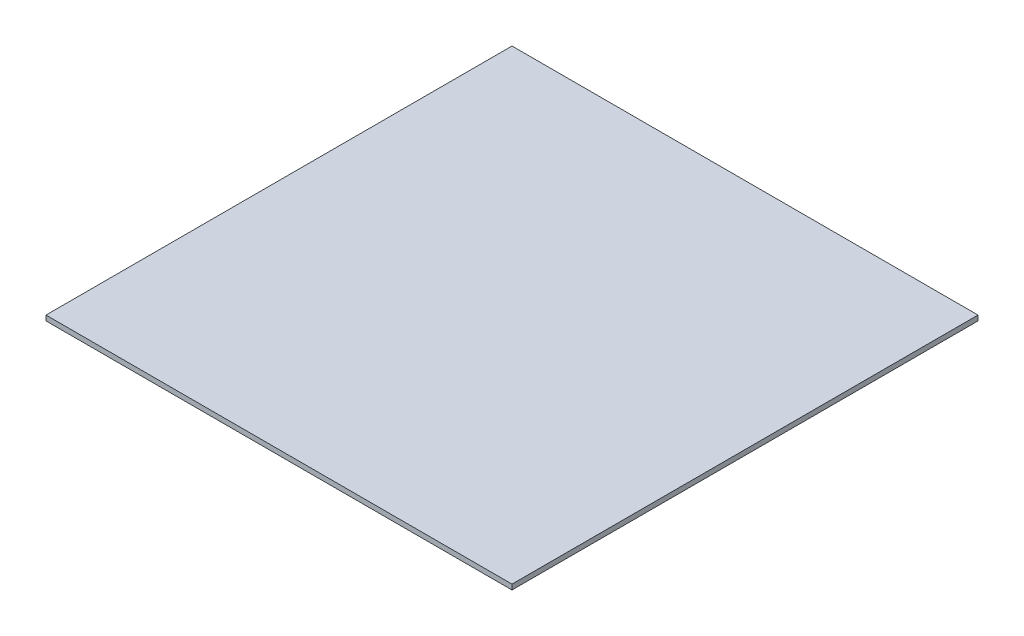
ISO-10303-21;
HEADER;
FILE_DESCRIPTION(('STEP AP214'),'2;1');
FILE_NAME('part.step','',(''),(''),'','','');
FILE_SCHEMA(('AUTOMOTIVE_DESIGN { 1 0 10303 214 1 1 1 1 }'));
ENDSEC;
DATA;
#1=APPLICATION_CONTEXT('core data for automotive mechanical design processes');
#2=APPLICATION_PROTOCOL_DEFINITION('international standard','automotive_design',2000,#1);
#3=PRODUCT_CONTEXT('',#1,'mechanical');
#4=PRODUCT('Part','Part','',(#3));
#5=PRODUCT_RELATED_PRODUCT_CATEGORY('part','',(#4));
#6=PRODUCT_DEFINITION_FORMATION('','',#4);
#7=PRODUCT_DEFINITION_CONTEXT('part definition',#1,'design');
#8=PRODUCT_DEFINITION('design','',#6,#7);
#9=PRODUCT_DEFINITION_SHAPE('','',#8);
#10=(LENGTH_UNIT() NAMED_UNIT(*) SI_UNIT(.MILLI.,.METRE.));
#11=(NAMED_UNIT(*) PLANE_ANGLE_UNIT() SI_UNIT($,.RADIAN.));
#12=(NAMED_UNIT(*) SI_UNIT($,.STERADIAN.) SOLID_ANGLE_UNIT());
#13=UNCERTAINTY_MEASURE_WITH_UNIT(LENGTH_MEASURE(1.E-05),#10,'distance_accuracy_value','');
#14=(GEOMETRIC_REPRESENTATION_CONTEXT(3) GLOBAL_UNCERTAINTY_ASSIGNED_CONTEXT((#13)) GLOBAL_UNIT_ASSIGNED_CONTEXT((#10,
#11,#12)) REPRESENTATION_CONTEXT('',''));
#15=CARTESIAN_POINT('',(0.,0.,0.));
#16=DIRECTION('',(0.,0.,1.));
#17=DIRECTION('',(1.,0.,0.));
#18=AXIS2_PLACEMENT_3D('',#15,#16,#17);
#19=CARTESIAN_POINT('',(-145.,1.5875,145.));
#20=DIRECTION('',(1.,0.,0.));
#21=DIRECTION('',(0.,0.,-1.));
#22=AXIS2_PLACEMENT_3D('',#19,#20,#21);
#23=PLANE('',#22);
#24=DIRECTION('',(0.,0.,1.));
#25=VECTOR('',#24,1.);
#26=CARTESIAN_POINT('',(-145.,-1.5875,145.));
#27=LINE('',#26,#25);
#28=CARTESIAN_POINT('',(-145.,-1.5875,-145.));
#29=VERTEX_POINT('',#28);
#30=CARTESIAN_POINT('',(-145.,-1.5875,145.));
#31=VERTEX_POINT('',#30);
#32=EDGE_CURVE('E95',#29,#31,#27,.T.);
#33=ORIENTED_EDGE('',*,*,#32,.T.);
#34=DIRECTION('',(0.,-1.,0.));
#35=VECTOR('',#34,1.);
#36=CARTESIAN_POINT('',(-145.,1.5875,145.));
#37=LINE('',#36,#35);
#38=CARTESIAN_POINT('',(-145.,1.5875,145.));
#39=VERTEX_POINT('',#38);
#40=EDGE_CURVE('E11',#39,#31,#37,.T.);
#41=ORIENTED_EDGE('',*,*,#40,.F.);
#42=DIRECTION('',(0.,0.,1.));
#43=VECTOR('',#42,1.);
#44=CARTESIAN_POINT('',(-145.,1.5875,145.));
#45=LINE('',#44,#43);
#46=CARTESIAN_POINT('',(-145.,1.5875,-145.));
#47=VERTEX_POINT('',#46);
#48=EDGE_CURVE('E83',#47,#39,#45,.T.);
#49=ORIENTED_EDGE('',*,*,#48,.F.);
#50=DIRECTION('',(0.,-1.,0.));
#51=VECTOR('',#50,1.);
#52=CARTESIAN_POINT('',(-145.,1.5875,-145.));
#53=LINE('',#52,#51);
#54=EDGE_CURVE('E91',#47,#29,#53,.T.);
#55=ORIENTED_EDGE('',*,*,#54,.T.);
#56=EDGE_LOOP('',(#33,#41,#49,#55));
#57=FACE_BOUND('',#56,.T.);
#58=ADVANCED_FACE('F32',(#57),#23,.F.);
#59=CARTESIAN_POINT('',(145.,1.5875,145.));
#60=DIRECTION('',(0.,0.,-1.));
#61=DIRECTION('',(-1.,0.,0.));
#62=AXIS2_PLACEMENT_3D('',#59,#60,#61);
#63=PLANE('',#62);
#64=DIRECTION('',(1.,0.,0.));
#65=VECTOR('',#64,1.);
#66=CARTESIAN_POINT('',(145.,-1.5875,145.));
#67=LINE('',#66,#65);
#68=CARTESIAN_POINT('',(145.,-1.5875,145.));
#69=VERTEX_POINT('',#68);
#70=EDGE_CURVE('E87',#31,#69,#67,.T.);
#71=ORIENTED_EDGE('',*,*,#70,.T.);
#72=DIRECTION('',(0.,-1.,0.));
#73=VECTOR('',#72,1.);
#74=CARTESIAN_POINT('',(145.,1.5875,145.));
#75=LINE('',#74,#73);
#76=CARTESIAN_POINT('',(145.,1.5875,145.));
#77=VERTEX_POINT('',#76);
#78=EDGE_CURVE('E40',#77,#69,#75,.T.);
#79=ORIENTED_EDGE('',*,*,#78,.F.);
#80=DIRECTION('',(1.,0.,0.));
#81=VECTOR('',#80,1.);
#82=CARTESIAN_POINT('',(145.,1.5875,145.));
#83=LINE('',#82,#81);
#84=EDGE_CURVE('E78',#39,#77,#83,.T.);
#85=ORIENTED_EDGE('',*,*,#84,.F.);
#86=ORIENTED_EDGE('',*,*,#40,.T.);
#87=EDGE_LOOP('',(#71,#79,#85,#86));
#88=FACE_BOUND('',#87,.T.);
#89=ADVANCED_FACE('F86',(#88),#63,.F.);
#90=CARTESIAN_POINT('',(145.,1.5875,145.));
#91=DIRECTION('',(-1.,0.,0.));
#92=DIRECTION('',(0.,0.,1.));
#93=AXIS2_PLACEMENT_3D('',#90,#91,#92);
#94=PLANE('',#93);
#95=DIRECTION('',(0.,0.,-1.));
#96=VECTOR('',#95,1.);
#97=CARTESIAN_POINT('',(145.,-1.5875,145.));
#98=LINE('',#97,#96);
#99=CARTESIAN_POINT('',(145.,-1.5875,-145.));
#100=VERTEX_POINT('',#99);
#101=EDGE_CURVE('E65',#69,#100,#98,.T.);
#102=ORIENTED_EDGE('',*,*,#101,.T.);
#103=DIRECTION('',(0.,-1.,0.));
#104=VECTOR('',#103,1.);
#105=CARTESIAN_POINT('',(145.,1.5875,-145.));
#106=LINE('',#105,#104);
#107=CARTESIAN_POINT('',(145.,1.5875,-145.));
#108=VERTEX_POINT('',#107);
#109=EDGE_CURVE('E88',#108,#100,#106,.T.);
#110=ORIENTED_EDGE('',*,*,#109,.F.);
#111=DIRECTION('',(0.,0.,-1.));
#112=VECTOR('',#111,1.);
#113=CARTESIAN_POINT('',(145.,1.5875,145.));
#114=LINE('',#113,#112);
#115=EDGE_CURVE('E81',#77,#108,#114,.T.);
#116=ORIENTED_EDGE('',*,*,#115,.F.);
#117=ORIENTED_EDGE('',*,*,#78,.T.);
#118=EDGE_LOOP('',(#102,#110,#116,#117));
#119=FACE_BOUND('',#118,.T.);
#120=ADVANCED_FACE('F89',(#119),#94,.F.);
#121=CARTESIAN_POINT('',(145.,1.5875,-145.));
#122=DIRECTION('',(0.,0.,1.));
#123=DIRECTION('',(1.,0.,0.));
#124=AXIS2_PLACEMENT_3D('',#121,#122,#123);
#125=PLANE('',#124);
#126=DIRECTION('',(-1.,0.,0.));
#127=VECTOR('',#126,1.);
#128=CARTESIAN_POINT('',(145.,-1.5875,-145.));
#129=LINE('',#128,#127);
#130=EDGE_CURVE('E71',#100,#29,#129,.T.);
#131=ORIENTED_EDGE('',*,*,#130,.T.);
#132=ORIENTED_EDGE('',*,*,#54,.F.);
#133=DIRECTION('',(-1.,0.,0.));
#134=VECTOR('',#133,1.);
#135=CARTESIAN_POINT('',(145.,1.5875,-145.));
#136=LINE('',#135,#134);
#137=EDGE_CURVE('E48',#108,#47,#136,.T.);
#138=ORIENTED_EDGE('',*,*,#137,.F.);
#139=ORIENTED_EDGE('',*,*,#109,.T.);
#140=EDGE_LOOP('',(#131,#132,#138,#139));
#141=FACE_BOUND('',#140,.T.);
#142=ADVANCED_FACE('F102',(#141),#125,.F.);
#143=CARTESIAN_POINT('',(0.,1.5875,0.));
#144=DIRECTION('',(0.,1.,0.));
#145=DIRECTION('',(0.,0.,1.));
#146=AXIS2_PLACEMENT_3D('',#143,#144,#145);
#147=PLANE('',#146);
#148=ORIENTED_EDGE('',*,*,#48,.T.);
#149=ORIENTED_EDGE('',*,*,#84,.T.);
#150=ORIENTED_EDGE('',*,*,#115,.T.);
#151=ORIENTED_EDGE('',*,*,#137,.T.);
#152=EDGE_LOOP('',(#148,#149,#150,#151));
#153=FACE_BOUND('',#152,.T.);
#154=ADVANCED_FACE('F79',(#153),#147,.T.);
#155=CARTESIAN_POINT('',(0.,-1.5875,0.));
#156=DIRECTION('',(0.,1.,0.));
#157=DIRECTION('',(0.,0.,1.));
#158=AXIS2_PLACEMENT_3D('',#155,#156,#157);
#159=PLANE('',#158);
#160=ORIENTED_EDGE('',*,*,#32,.F.);
#161=ORIENTED_EDGE('',*,*,#130,.F.);
#162=ORIENTED_EDGE('',*,*,#101,.F.);
#163=ORIENTED_EDGE('',*,*,#70,.F.);
#164=EDGE_LOOP('',(#160,#161,#162,#163));
#165=FACE_BOUND('',#164,.T.);
#166=ADVANCED_FACE('F105',(#165),#159,.F.);
#167=CLOSED_SHELL('',(#58,#89,#120,#142,#154,#166));
#168=MANIFOLD_SOLID_BREP('B2',#167);
#169=ADVANCED_BREP_SHAPE_REPRESENTATION('',(#18,#168),#14);
#170=SHAPE_DEFINITION_REPRESENTATION(#9,#169);
ENDSEC;
END-ISO-10303-21;
